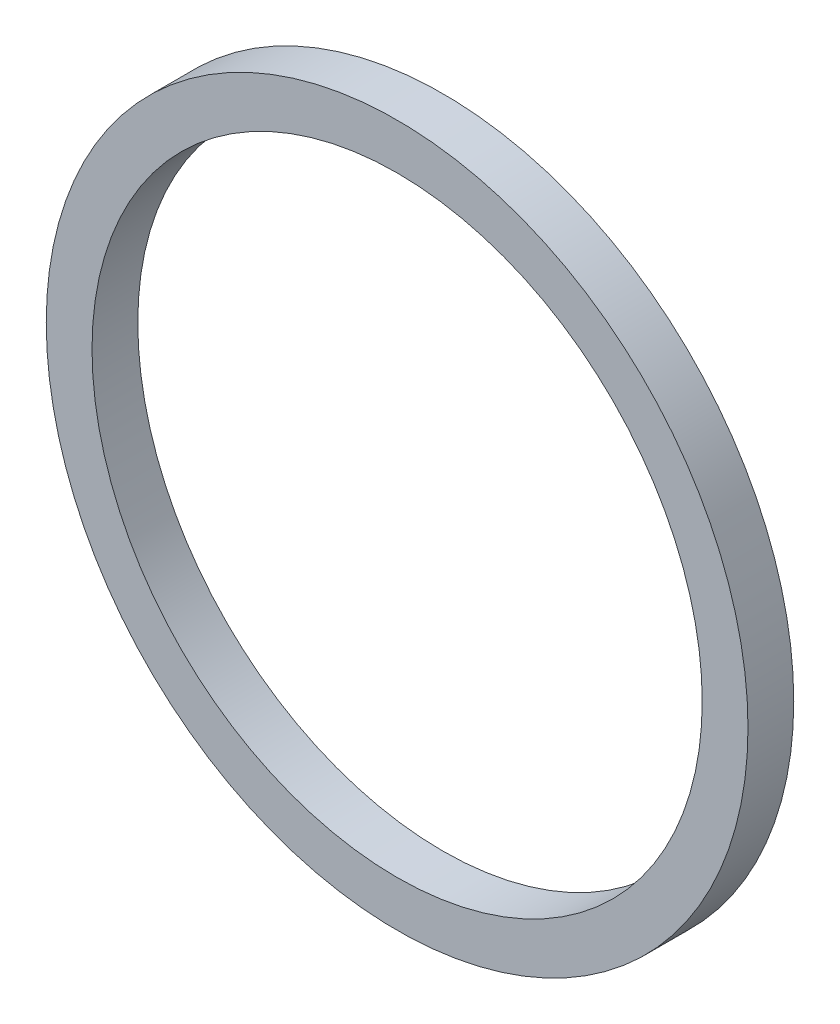
ISO-10303-21;
HEADER;
FILE_DESCRIPTION(('STEP AP214'),'2;1');
FILE_NAME('part.step','',(''),(''),'','','');
FILE_SCHEMA(('AUTOMOTIVE_DESIGN { 1 0 10303 214 1 1 1 1 }'));
ENDSEC;
DATA;
#1=APPLICATION_CONTEXT('core data for automotive mechanical design processes');
#2=APPLICATION_PROTOCOL_DEFINITION('international standard','automotive_design',2000,#1);
#3=PRODUCT_CONTEXT('',#1,'mechanical');
#4=PRODUCT('Part','Part','',(#3));
#5=PRODUCT_RELATED_PRODUCT_CATEGORY('part','',(#4));
#6=PRODUCT_DEFINITION_FORMATION('','',#4);
#7=PRODUCT_DEFINITION_CONTEXT('part definition',#1,'design');
#8=PRODUCT_DEFINITION('design','',#6,#7);
#9=PRODUCT_DEFINITION_SHAPE('','',#8);
#10=(LENGTH_UNIT() NAMED_UNIT(*) SI_UNIT(.MILLI.,.METRE.));
#11=(NAMED_UNIT(*) PLANE_ANGLE_UNIT() SI_UNIT($,.RADIAN.));
#12=(NAMED_UNIT(*) SI_UNIT($,.STERADIAN.) SOLID_ANGLE_UNIT());
#13=UNCERTAINTY_MEASURE_WITH_UNIT(LENGTH_MEASURE(1.E-05),#10,'distance_accuracy_value','');
#14=(GEOMETRIC_REPRESENTATION_CONTEXT(3) GLOBAL_UNCERTAINTY_ASSIGNED_CONTEXT((#13)) GLOBAL_UNIT_ASSIGNED_CONTEXT((#10,
#11,#12)) REPRESENTATION_CONTEXT('',''));
#15=CARTESIAN_POINT('',(0.,0.,0.));
#16=DIRECTION('',(0.,0.,1.));
#17=DIRECTION('',(1.,0.,0.));
#18=AXIS2_PLACEMENT_3D('',#15,#16,#17);
#19=CARTESIAN_POINT('',(0.,0.,1.5));
#20=DIRECTION('',(0.,0.,1.));
#21=DIRECTION('',(1.,0.,0.));
#22=AXIS2_PLACEMENT_3D('',#19,#20,#21);
#23=PLANE('',#22);
#24=CARTESIAN_POINT('',(0.,0.,1.5));
#25=DIRECTION('',(0.,0.,1.));
#26=DIRECTION('',(1.,0.,0.));
#27=AXIS2_PLACEMENT_3D('',#24,#25,#26);
#28=CIRCLE('',#27,11.5);
#29=CARTESIAN_POINT('',(11.5,0.,1.5));
#30=VERTEX_POINT('',#29);
#31=EDGE_CURVE('E10',#30,#30,#28,.T.);
#32=ORIENTED_EDGE('',*,*,#31,.T.);
#33=EDGE_LOOP('',(#32));
#34=FACE_BOUND('',#33,.T.);
#35=CARTESIAN_POINT('',(0.,0.,1.5));
#36=DIRECTION('',(0.,0.,1.));
#37=DIRECTION('',(1.,0.,0.));
#38=AXIS2_PLACEMENT_3D('',#35,#36,#37);
#39=CIRCLE('',#38,10.);
#40=CARTESIAN_POINT('',(10.,0.,1.5));
#41=VERTEX_POINT('',#40);
#42=EDGE_CURVE('E50',#41,#41,#39,.T.);
#43=ORIENTED_EDGE('',*,*,#42,.F.);
#44=EDGE_LOOP('',(#43));
#45=FACE_BOUND('',#44,.T.);
#46=ADVANCED_FACE('F37',(#34,#45),#23,.T.);
#47=CARTESIAN_POINT('',(0.,0.,0.));
#48=DIRECTION('',(0.,0.,1.));
#49=DIRECTION('',(1.,0.,0.));
#50=AXIS2_PLACEMENT_3D('',#47,#48,#49);
#51=PLANE('',#50);
#52=CARTESIAN_POINT('',(0.,0.,0.));
#53=DIRECTION('',(0.,0.,1.));
#54=DIRECTION('',(1.,0.,0.));
#55=AXIS2_PLACEMENT_3D('',#52,#53,#54);
#56=CIRCLE('',#55,11.5);
#57=CARTESIAN_POINT('',(11.5,0.,0.));
#58=VERTEX_POINT('',#57);
#59=EDGE_CURVE('E41',#58,#58,#56,.T.);
#60=ORIENTED_EDGE('',*,*,#59,.F.);
#61=EDGE_LOOP('',(#60));
#62=FACE_BOUND('',#61,.T.);
#63=CARTESIAN_POINT('',(0.,0.,0.));
#64=DIRECTION('',(0.,0.,1.));
#65=DIRECTION('',(1.,0.,0.));
#66=AXIS2_PLACEMENT_3D('',#63,#64,#65);
#67=CIRCLE('',#66,10.);
#68=CARTESIAN_POINT('',(10.,0.,0.));
#69=VERTEX_POINT('',#68);
#70=EDGE_CURVE('E52',#69,#69,#67,.T.);
#71=ORIENTED_EDGE('',*,*,#70,.T.);
#72=EDGE_LOOP('',(#71));
#73=FACE_BOUND('',#72,.T.);
#74=ADVANCED_FACE('F64',(#62,#73),#51,.F.);
#75=CARTESIAN_POINT('',(0.,0.,1.5));
#76=DIRECTION('',(0.,0.,-1.));
#77=DIRECTION('',(-1.,0.,0.));
#78=AXIS2_PLACEMENT_3D('',#75,#76,#77);
#79=CYLINDRICAL_SURFACE('',#78,11.5);
#80=ORIENTED_EDGE('',*,*,#31,.F.);
#81=EDGE_LOOP('',(#80));
#82=FACE_BOUND('',#81,.T.);
#83=ORIENTED_EDGE('',*,*,#59,.T.);
#84=EDGE_LOOP('',(#83));
#85=FACE_BOUND('',#84,.T.);
#86=ADVANCED_FACE('F39',(#82,#85),#79,.T.);
#87=CARTESIAN_POINT('',(0.,0.,1.5));
#88=DIRECTION('',(0.,0.,-1.));
#89=DIRECTION('',(-1.,0.,0.));
#90=AXIS2_PLACEMENT_3D('',#87,#88,#89);
#91=CYLINDRICAL_SURFACE('',#90,10.);
#92=ORIENTED_EDGE('',*,*,#42,.T.);
#93=EDGE_LOOP('',(#92));
#94=FACE_BOUND('',#93,.T.);
#95=ORIENTED_EDGE('',*,*,#70,.F.);
#96=EDGE_LOOP('',(#95));
#97=FACE_BOUND('',#96,.T.);
#98=ADVANCED_FACE('F60',(#94,#97),#91,.F.);
#99=CLOSED_SHELL('',(#46,#74,#86,#98));
#100=MANIFOLD_SOLID_BREP('B2',#99);
#101=ADVANCED_BREP_SHAPE_REPRESENTATION('',(#18,#100),#14);
#102=SHAPE_DEFINITION_REPRESENTATION(#9,#101);
ENDSEC;
END-ISO-10303-21;
